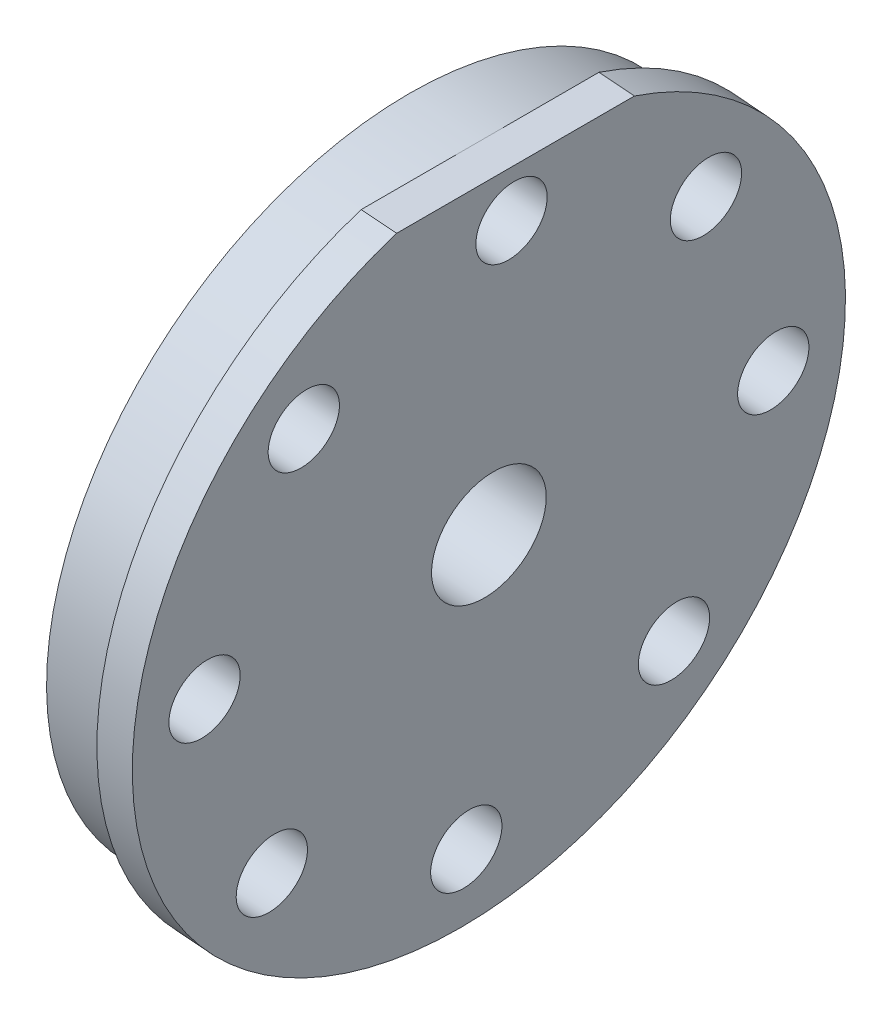
ISO-10303-21;
HEADER;
FILE_DESCRIPTION(('STEP AP214'),'2;1');
FILE_NAME('part.step','',(''),(''),'','','');
FILE_SCHEMA(('AUTOMOTIVE_DESIGN { 1 0 10303 214 1 1 1 1 }'));
ENDSEC;
DATA;
#1=APPLICATION_CONTEXT('core data for automotive mechanical design processes');
#2=APPLICATION_PROTOCOL_DEFINITION('international standard','automotive_design',2000,#1);
#3=PRODUCT_CONTEXT('',#1,'mechanical');
#4=PRODUCT('Part','Part','',(#3));
#5=PRODUCT_RELATED_PRODUCT_CATEGORY('part','',(#4));
#6=PRODUCT_DEFINITION_FORMATION('','',#4);
#7=PRODUCT_DEFINITION_CONTEXT('part definition',#1,'design');
#8=PRODUCT_DEFINITION('design','',#6,#7);
#9=PRODUCT_DEFINITION_SHAPE('','',#8);
#10=(LENGTH_UNIT() NAMED_UNIT(*) SI_UNIT(.MILLI.,.METRE.));
#11=(NAMED_UNIT(*) PLANE_ANGLE_UNIT() SI_UNIT($,.RADIAN.));
#12=(NAMED_UNIT(*) SI_UNIT($,.STERADIAN.) SOLID_ANGLE_UNIT());
#13=UNCERTAINTY_MEASURE_WITH_UNIT(LENGTH_MEASURE(1.E-05),#10,'distance_accuracy_value','');
#14=(GEOMETRIC_REPRESENTATION_CONTEXT(3) GLOBAL_UNCERTAINTY_ASSIGNED_CONTEXT((#13)) GLOBAL_UNIT_ASSIGNED_CONTEXT((#10,
#11,#12)) REPRESENTATION_CONTEXT('',''));
#15=CARTESIAN_POINT('',(0.,0.,0.));
#16=DIRECTION('',(0.,0.,1.));
#17=DIRECTION('',(1.,0.,0.));
#18=AXIS2_PLACEMENT_3D('',#15,#16,#17);
#19=CARTESIAN_POINT('',(230.211383275251,-9.78704603325022,43.174261814343));
#20=DIRECTION('',(0.996833274877087,-0.0795199477981641,0.));
#21=DIRECTION('',(0.0795199477981641,0.996833274877087,0.));
#22=AXIS2_PLACEMENT_3D('',#19,#20,#21);
#23=CYLINDRICAL_SURFACE('',#22,14.9606);
#24=CARTESIAN_POINT('',(233.376328922986,-10.0395218675094,43.174261814343));
#25=DIRECTION('',(-0.996833274877087,0.0795199477981641,0.));
#26=DIRECTION('',(-0.0795199477981641,-0.996833274877087,0.));
#27=AXIS2_PLACEMENT_3D('',#24,#25,#26);
#28=CIRCLE('',#27,14.9606);
#29=CARTESIAN_POINT('',(234.565995054015,4.87370202461675,43.174261814343));
#30=VERTEX_POINT('',#29);
#31=EDGE_CURVE('E71',#30,#30,#28,.F.);
#32=ORIENTED_EDGE('',*,*,#31,.F.);
#33=EDGE_LOOP('',(#32));
#34=FACE_BOUND('',#33,.T.);
#35=CARTESIAN_POINT('',(230.211383275251,-9.78704603325022,43.174261814343));
#36=DIRECTION('',(0.996833274877087,-0.0795199477981641,0.));
#37=DIRECTION('',(0.0795199477981641,0.996833274877087,0.));
#38=AXIS2_PLACEMENT_3D('',#35,#36,#37);
#39=CIRCLE('',#38,14.9606);
#40=CARTESIAN_POINT('',(231.40104940628,5.12617785887592,43.174261814343));
#41=VERTEX_POINT('',#40);
#42=EDGE_CURVE('E131',#41,#41,#39,.T.);
#43=ORIENTED_EDGE('',*,*,#42,.T.);
#44=EDGE_LOOP('',(#43));
#45=FACE_BOUND('',#44,.T.);
#46=ADVANCED_FACE('F36',(#34,#45),#23,.T.);
#47=CARTESIAN_POINT('',(230.211383275251,-9.78704603325022,43.174261814343));
#48=DIRECTION('',(0.996833274877087,-0.0795199477981641,0.));
#49=DIRECTION('',(0.0795199477981641,0.996833274877087,0.));
#50=AXIS2_PLACEMENT_3D('',#47,#48,#49);
#51=PLANE('',#50);
#52=CARTESIAN_POINT('',(230.211383275251,-9.78704603325057,30.4742618143433));
#53=DIRECTION('',(-0.996833274877087,0.0795199477981641,0.));
#54=DIRECTION('',(-0.0795199477981641,-0.996833274877087,0.));
#55=AXIS2_PLACEMENT_3D('',#52,#53,#54);
#56=CIRCLE('',#55,1.5875);
#57=CARTESIAN_POINT('',(230.085145358121,-11.3695188571179,30.4742618143433));
#58=VERTEX_POINT('',#57);
#59=EDGE_CURVE('E91',#58,#58,#56,.T.);
#60=ORIENTED_EDGE('',*,*,#59,.F.);
#61=EDGE_LOOP('',(#60));
#62=FACE_BOUND('',#61,.T.);
#63=CARTESIAN_POINT('',(230.925492773212,-0.835227914850099,34.1940056932739));
#64=DIRECTION('',(-0.996833274877087,0.0795199477981641,0.));
#65=DIRECTION('',(-0.0795199477981641,-0.996833274877087,0.));
#66=AXIS2_PLACEMENT_3D('',#63,#64,#65);
#67=CIRCLE('',#66,1.5875);
#68=CARTESIAN_POINT('',(230.799254856083,-2.41770073871747,34.1940056932739));
#69=VERTEX_POINT('',#68);
#70=EDGE_CURVE('E86',#69,#69,#67,.T.);
#71=ORIENTED_EDGE('',*,*,#70,.F.);
#72=EDGE_LOOP('',(#71));
#73=FACE_BOUND('',#72,.T.);
#74=CARTESIAN_POINT('',(229.497273777289,-18.7388641516508,34.1940056932744));
#75=DIRECTION('',(-0.996833274877087,0.0795199477981641,0.));
#76=DIRECTION('',(-0.0795199477981641,-0.996833274877087,0.));
#77=AXIS2_PLACEMENT_3D('',#74,#75,#76);
#78=CIRCLE('',#77,1.5875);
#79=CARTESIAN_POINT('',(229.37103586016,-20.3213369755182,34.1940056932744));
#80=VERTEX_POINT('',#79);
#81=EDGE_CURVE('E102',#80,#80,#78,.T.);
#82=ORIENTED_EDGE('',*,*,#81,.F.);
#83=EDGE_LOOP('',(#82));
#84=FACE_BOUND('',#83,.T.);
#85=CARTESIAN_POINT('',(229.201479938214,-22.4468286241892,43.1742618143437));
#86=DIRECTION('',(-0.996833274877087,0.0795199477981641,0.));
#87=DIRECTION('',(-0.0795199477981641,-0.996833274877087,0.));
#88=AXIS2_PLACEMENT_3D('',#85,#86,#87);
#89=CIRCLE('',#88,1.5875);
#90=CARTESIAN_POINT('',(229.075242021085,-24.0293014480566,43.1742618143437));
#91=VERTEX_POINT('',#90);
#92=EDGE_CURVE('E97',#91,#91,#89,.T.);
#93=ORIENTED_EDGE('',*,*,#92,.F.);
#94=EDGE_LOOP('',(#93));
#95=FACE_BOUND('',#94,.T.);
#96=CARTESIAN_POINT('',(229.497273777289,-18.7388641516504,52.1545179354127));
#97=DIRECTION('',(-0.996833274877087,0.0795199477981641,0.));
#98=DIRECTION('',(-0.0795199477981641,-0.996833274877087,0.));
#99=AXIS2_PLACEMENT_3D('',#96,#97,#98);
#100=CIRCLE('',#99,1.5875);
#101=CARTESIAN_POINT('',(229.37103586016,-20.3213369755177,52.1545179354127));
#102=VERTEX_POINT('',#101);
#103=EDGE_CURVE('E101',#102,#102,#100,.T.);
#104=ORIENTED_EDGE('',*,*,#103,.F.);
#105=EDGE_LOOP('',(#104));
#106=FACE_BOUND('',#105,.T.);
#107=CARTESIAN_POINT('',(230.211383275251,-9.78704603324989,55.8742618143433));
#108=DIRECTION('',(-0.996833274877087,0.0795199477981641,0.));
#109=DIRECTION('',(-0.0795199477981641,-0.996833274877087,0.));
#110=AXIS2_PLACEMENT_3D('',#107,#108,#109);
#111=CIRCLE('',#110,1.5875);
#112=CARTESIAN_POINT('',(230.085145358121,-11.3695188571173,55.8742618143433));
#113=VERTEX_POINT('',#112);
#114=EDGE_CURVE('E115',#113,#113,#111,.T.);
#115=ORIENTED_EDGE('',*,*,#114,.F.);
#116=EDGE_LOOP('',(#115));
#117=FACE_BOUND('',#116,.T.);
#118=CARTESIAN_POINT('',(230.925492773213,-0.835227914849618,52.1545179354122));
#119=DIRECTION('',(-0.996833274877087,0.0795199477981641,0.));
#120=DIRECTION('',(-0.0795199477981641,-0.996833274877087,0.));
#121=AXIS2_PLACEMENT_3D('',#118,#119,#120);
#122=CIRCLE('',#121,1.5875);
#123=CARTESIAN_POINT('',(230.799254856083,-2.41770073871699,52.1545179354122));
#124=VERTEX_POINT('',#123);
#125=EDGE_CURVE('E112',#124,#124,#122,.T.);
#126=ORIENTED_EDGE('',*,*,#125,.F.);
#127=EDGE_LOOP('',(#126));
#128=FACE_BOUND('',#127,.T.);
#129=CARTESIAN_POINT('',(231.221286612288,2.87273655768877,43.174261814343));
#130=DIRECTION('',(-0.996833274877087,0.0795199477981641,0.));
#131=DIRECTION('',(-0.0795199477981641,-0.996833274877087,0.));
#132=AXIS2_PLACEMENT_3D('',#129,#130,#131);
#133=CIRCLE('',#132,1.5875);
#134=CARTESIAN_POINT('',(231.095048695158,1.2902637338214,43.174261814343));
#135=VERTEX_POINT('',#134);
#136=EDGE_CURVE('E96',#135,#135,#133,.T.);
#137=ORIENTED_EDGE('',*,*,#136,.F.);
#138=EDGE_LOOP('',(#137));
#139=FACE_BOUND('',#138,.T.);
#140=CARTESIAN_POINT('',(230.211383275251,-9.78704603325022,43.174261814343));
#141=DIRECTION('',(0.996833274877087,-0.0795199477981641,0.));
#142=DIRECTION('',(0.0795199477981641,0.996833274877087,0.));
#143=AXIS2_PLACEMENT_3D('',#140,#141,#142);
#144=CIRCLE('',#143,2.5527);
#145=CARTESIAN_POINT('',(230.414373845995,-7.24242973247148,43.174261814343));
#146=VERTEX_POINT('',#145);
#147=EDGE_CURVE('E126',#146,#146,#144,.T.);
#148=ORIENTED_EDGE('',*,*,#147,.T.);
#149=EDGE_LOOP('',(#148));
#150=FACE_BOUND('',#149,.T.);
#151=ORIENTED_EDGE('',*,*,#42,.F.);
#152=EDGE_LOOP('',(#151));
#153=FACE_BOUND('',#152,.T.);
#154=ADVANCED_FACE('F173',(#62,#73,#84,#95,#106,#117,#128,#139,#150,#153),#51,.F.);
#155=CARTESIAN_POINT('',(234.958801746853,-10.165759784639,43.174261814343));
#156=DIRECTION('',(0.996833274877087,-0.0795199477981641,0.));
#157=DIRECTION('',(0.0795199477981641,0.996833274877087,0.));
#158=AXIS2_PLACEMENT_3D('',#155,#156,#157);
#159=PLANE('',#158);
#160=DIRECTION('',(0.,0.,-1.));
#161=VECTOR('',#160,1.);
#162=CARTESIAN_POINT('',(236.148467877882,4.74746410748716,0.));
#163=LINE('',#162,#161);
#164=CARTESIAN_POINT('',(236.148467877882,4.74746410748716,48.4842592380712));
#165=VERTEX_POINT('',#164);
#166=CARTESIAN_POINT('',(236.148467877882,4.74746410748716,37.8642643906148));
#167=VERTEX_POINT('',#166);
#168=EDGE_CURVE('E65',#165,#167,#163,.T.);
#169=ORIENTED_EDGE('',*,*,#168,.F.);
#170=CARTESIAN_POINT('',(234.958801746853,-10.165759784639,43.174261814343));
#171=DIRECTION('',(-0.996833274877087,0.0795199477981641,0.));
#172=DIRECTION('',(-0.0795199477981641,-0.996833274877087,0.));
#173=AXIS2_PLACEMENT_3D('',#170,#171,#172);
#174=CIRCLE('',#173,15.875);
#175=EDGE_CURVE('E76',#167,#165,#174,.T.);
#176=ORIENTED_EDGE('',*,*,#175,.F.);
#177=EDGE_LOOP('',(#169,#176));
#178=FACE_BOUND('',#177,.T.);
#179=CARTESIAN_POINT('',(234.958801746853,-10.1657597846393,30.4742618143433));
#180=DIRECTION('',(0.996833274877087,-0.0795199477981641,0.));
#181=DIRECTION('',(0.0795199477981641,0.996833274877087,0.));
#182=AXIS2_PLACEMENT_3D('',#179,#180,#181);
#183=CIRCLE('',#182,1.5875);
#184=CARTESIAN_POINT('',(235.085039663983,-8.58328696077195,30.4742618143433));
#185=VERTEX_POINT('',#184);
#186=EDGE_CURVE('E127',#185,#185,#183,.T.);
#187=ORIENTED_EDGE('',*,*,#186,.F.);
#188=EDGE_LOOP('',(#187));
#189=FACE_BOUND('',#188,.T.);
#190=CARTESIAN_POINT('',(235.672911244815,-1.21394166623885,34.1940056932739));
#191=DIRECTION('',(0.996833274877087,-0.0795199477981641,0.));
#192=DIRECTION('',(0.0795199477981641,0.996833274877087,0.));
#193=AXIS2_PLACEMENT_3D('',#190,#191,#192);
#194=CIRCLE('',#193,1.5875);
#195=CARTESIAN_POINT('',(235.799149161944,0.36853115762852,34.1940056932739));
#196=VERTEX_POINT('',#195);
#197=EDGE_CURVE('E158',#196,#196,#194,.T.);
#198=ORIENTED_EDGE('',*,*,#197,.F.);
#199=EDGE_LOOP('',(#198));
#200=FACE_BOUND('',#199,.T.);
#201=CARTESIAN_POINT('',(234.244692248891,-19.1175779030396,34.1940056932744));
#202=DIRECTION('',(0.996833274877087,-0.0795199477981641,0.));
#203=DIRECTION('',(0.0795199477981641,0.996833274877087,0.));
#204=AXIS2_PLACEMENT_3D('',#201,#202,#203);
#205=CIRCLE('',#204,1.5875);
#206=CARTESIAN_POINT('',(234.370930166021,-17.5351050791722,34.1940056932744));
#207=VERTEX_POINT('',#206);
#208=EDGE_CURVE('E154',#207,#207,#205,.T.);
#209=ORIENTED_EDGE('',*,*,#208,.F.);
#210=EDGE_LOOP('',(#209));
#211=FACE_BOUND('',#210,.T.);
#212=CARTESIAN_POINT('',(233.948898409816,-22.825542375578,43.1742618143437));
#213=DIRECTION('',(0.996833274877087,-0.0795199477981641,0.));
#214=DIRECTION('',(0.0795199477981641,0.996833274877087,0.));
#215=AXIS2_PLACEMENT_3D('',#212,#213,#214);
#216=CIRCLE('',#215,1.5875);
#217=CARTESIAN_POINT('',(234.075136326946,-21.2430695517106,43.1742618143437));
#218=VERTEX_POINT('',#217);
#219=EDGE_CURVE('E150',#218,#218,#216,.T.);
#220=ORIENTED_EDGE('',*,*,#219,.F.);
#221=EDGE_LOOP('',(#220));
#222=FACE_BOUND('',#221,.T.);
#223=CARTESIAN_POINT('',(234.244692248891,-19.1175779030391,52.1545179354127));
#224=DIRECTION('',(0.996833274877087,-0.0795199477981641,0.));
#225=DIRECTION('',(0.0795199477981641,0.996833274877087,0.));
#226=AXIS2_PLACEMENT_3D('',#223,#224,#225);
#227=CIRCLE('',#226,1.5875);
#228=CARTESIAN_POINT('',(234.370930166021,-17.5351050791717,52.1545179354127));
#229=VERTEX_POINT('',#228);
#230=EDGE_CURVE('E146',#229,#229,#227,.T.);
#231=ORIENTED_EDGE('',*,*,#230,.F.);
#232=EDGE_LOOP('',(#231));
#233=FACE_BOUND('',#232,.T.);
#234=CARTESIAN_POINT('',(234.958801746853,-10.1657597846386,55.8742618143433));
#235=DIRECTION('',(0.996833274877087,-0.0795199477981641,0.));
#236=DIRECTION('',(0.0795199477981641,0.996833274877087,0.));
#237=AXIS2_PLACEMENT_3D('',#234,#235,#236);
#238=CIRCLE('',#237,1.5875);
#239=CARTESIAN_POINT('',(235.085039663983,-8.58328696077126,55.8742618143433));
#240=VERTEX_POINT('',#239);
#241=EDGE_CURVE('E142',#240,#240,#238,.T.);
#242=ORIENTED_EDGE('',*,*,#241,.F.);
#243=EDGE_LOOP('',(#242));
#244=FACE_BOUND('',#243,.T.);
#245=CARTESIAN_POINT('',(235.672911244815,-1.21394166623837,52.1545179354122));
#246=DIRECTION('',(0.996833274877087,-0.0795199477981641,0.));
#247=DIRECTION('',(0.0795199477981641,0.996833274877087,0.));
#248=AXIS2_PLACEMENT_3D('',#245,#246,#247);
#249=CIRCLE('',#248,1.5875);
#250=CARTESIAN_POINT('',(235.799149161944,0.368531157629006,52.1545179354122));
#251=VERTEX_POINT('',#250);
#252=EDGE_CURVE('E138',#251,#251,#249,.T.);
#253=ORIENTED_EDGE('',*,*,#252,.F.);
#254=EDGE_LOOP('',(#253));
#255=FACE_BOUND('',#254,.T.);
#256=CARTESIAN_POINT('',(235.96870508389,2.49402280630002,43.174261814343));
#257=DIRECTION('',(0.996833274877087,-0.0795199477981641,0.));
#258=DIRECTION('',(0.0795199477981641,0.996833274877087,0.));
#259=AXIS2_PLACEMENT_3D('',#256,#257,#258);
#260=CIRCLE('',#259,1.5875);
#261=CARTESIAN_POINT('',(236.094943001019,4.0764956301674,43.174261814343));
#262=VERTEX_POINT('',#261);
#263=EDGE_CURVE('E95',#262,#262,#260,.T.);
#264=ORIENTED_EDGE('',*,*,#263,.F.);
#265=EDGE_LOOP('',(#264));
#266=FACE_BOUND('',#265,.T.);
#267=CARTESIAN_POINT('',(234.958801746853,-10.165759784639,43.174261814343));
#268=DIRECTION('',(0.996833274877087,-0.0795199477981641,0.));
#269=DIRECTION('',(0.0795199477981641,0.996833274877087,0.));
#270=AXIS2_PLACEMENT_3D('',#267,#268,#269);
#271=CIRCLE('',#270,2.5527);
#272=CARTESIAN_POINT('',(235.161792317597,-7.62114348386024,43.174261814343));
#273=VERTEX_POINT('',#272);
#274=EDGE_CURVE('E122',#273,#273,#271,.T.);
#275=ORIENTED_EDGE('',*,*,#274,.F.);
#276=EDGE_LOOP('',(#275));
#277=FACE_BOUND('',#276,.T.);
#278=ADVANCED_FACE('F74',(#178,#189,#200,#211,#222,#233,#244,#255,#266,#277),#159,.T.);
#279=CARTESIAN_POINT('',(228.628910451384,-9.66080811612064,43.174261814343));
#280=DIRECTION('',(0.996833274877087,-0.0795199477981641,0.));
#281=DIRECTION('',(0.0795199477981641,0.996833274877087,0.));
#282=AXIS2_PLACEMENT_3D('',#279,#280,#281);
#283=CYLINDRICAL_SURFACE('',#282,2.5527);
#284=ORIENTED_EDGE('',*,*,#274,.T.);
#285=EDGE_LOOP('',(#284));
#286=FACE_BOUND('',#285,.T.);
#287=ORIENTED_EDGE('',*,*,#147,.F.);
#288=EDGE_LOOP('',(#287));
#289=FACE_BOUND('',#288,.T.);
#290=ADVANCED_FACE('F182',(#286,#289),#283,.F.);
#291=CARTESIAN_POINT('',(241.189619361059,2.07753707970713,43.174261814343));
#292=DIRECTION('',(-0.996833274877087,0.0795199477981641,0.));
#293=DIRECTION('',(-0.0795199477981641,-0.996833274877087,0.));
#294=AXIS2_PLACEMENT_3D('',#291,#292,#293);
#295=CYLINDRICAL_SURFACE('',#294,1.5875);
#296=ORIENTED_EDGE('',*,*,#263,.T.);
#297=EDGE_LOOP('',(#296));
#298=FACE_BOUND('',#297,.T.);
#299=ORIENTED_EDGE('',*,*,#136,.T.);
#300=EDGE_LOOP('',(#299));
#301=FACE_BOUND('',#300,.T.);
#302=ADVANCED_FACE('F188',(#298,#301),#295,.F.);
#303=CARTESIAN_POINT('',(240.893825521983,-1.63042739283126,52.1545179354122));
#304=DIRECTION('',(-0.996833274877087,0.0795199477981641,0.));
#305=DIRECTION('',(-0.0795199477981641,-0.996833274877087,0.));
#306=AXIS2_PLACEMENT_3D('',#303,#304,#305);
#307=CYLINDRICAL_SURFACE('',#306,1.5875);
#308=ORIENTED_EDGE('',*,*,#252,.T.);
#309=EDGE_LOOP('',(#308));
#310=FACE_BOUND('',#309,.T.);
#311=ORIENTED_EDGE('',*,*,#125,.T.);
#312=EDGE_LOOP('',(#311));
#313=FACE_BOUND('',#312,.T.);
#314=ADVANCED_FACE('F198',(#310,#313),#307,.F.);
#315=CARTESIAN_POINT('',(240.179716024022,-10.5822455112315,55.8742618143433));
#316=DIRECTION('',(-0.996833274877087,0.0795199477981641,0.));
#317=DIRECTION('',(-0.0795199477981641,-0.996833274877087,0.));
#318=AXIS2_PLACEMENT_3D('',#315,#316,#317);
#319=CYLINDRICAL_SURFACE('',#318,1.5875);
#320=ORIENTED_EDGE('',*,*,#241,.T.);
#321=EDGE_LOOP('',(#320));
#322=FACE_BOUND('',#321,.T.);
#323=ORIENTED_EDGE('',*,*,#114,.T.);
#324=EDGE_LOOP('',(#323));
#325=FACE_BOUND('',#324,.T.);
#326=ADVANCED_FACE('F194',(#322,#325),#319,.F.);
#327=CARTESIAN_POINT('',(239.46560652606,-19.534063629632,52.1545179354127));
#328=DIRECTION('',(-0.996833274877087,0.0795199477981641,0.));
#329=DIRECTION('',(-0.0795199477981641,-0.996833274877087,0.));
#330=AXIS2_PLACEMENT_3D('',#327,#328,#329);
#331=CYLINDRICAL_SURFACE('',#330,1.5875);
#332=ORIENTED_EDGE('',*,*,#230,.T.);
#333=EDGE_LOOP('',(#332));
#334=FACE_BOUND('',#333,.T.);
#335=ORIENTED_EDGE('',*,*,#103,.T.);
#336=EDGE_LOOP('',(#335));
#337=FACE_BOUND('',#336,.T.);
#338=ADVANCED_FACE('F190',(#334,#337),#331,.F.);
#339=CARTESIAN_POINT('',(239.169812686985,-23.2420281021709,43.1742618143437));
#340=DIRECTION('',(-0.996833274877087,0.0795199477981641,0.));
#341=DIRECTION('',(-0.0795199477981641,-0.996833274877087,0.));
#342=AXIS2_PLACEMENT_3D('',#339,#340,#341);
#343=CYLINDRICAL_SURFACE('',#342,1.5875);
#344=ORIENTED_EDGE('',*,*,#219,.T.);
#345=EDGE_LOOP('',(#344));
#346=FACE_BOUND('',#345,.T.);
#347=ORIENTED_EDGE('',*,*,#92,.T.);
#348=EDGE_LOOP('',(#347));
#349=FACE_BOUND('',#348,.T.);
#350=ADVANCED_FACE('F193',(#346,#349),#343,.F.);
#351=CARTESIAN_POINT('',(239.46560652606,-19.5340636296325,34.1940056932744));
#352=DIRECTION('',(-0.996833274877087,0.0795199477981641,0.));
#353=DIRECTION('',(-0.0795199477981641,-0.996833274877087,0.));
#354=AXIS2_PLACEMENT_3D('',#351,#352,#353);
#355=CYLINDRICAL_SURFACE('',#354,1.5875);
#356=ORIENTED_EDGE('',*,*,#208,.T.);
#357=EDGE_LOOP('',(#356));
#358=FACE_BOUND('',#357,.T.);
#359=ORIENTED_EDGE('',*,*,#81,.T.);
#360=EDGE_LOOP('',(#359));
#361=FACE_BOUND('',#360,.T.);
#362=ADVANCED_FACE('F210',(#358,#361),#355,.F.);
#363=CARTESIAN_POINT('',(240.893825521983,-1.63042739283174,34.1940056932739));
#364=DIRECTION('',(-0.996833274877087,0.0795199477981641,0.));
#365=DIRECTION('',(-0.0795199477981641,-0.996833274877087,0.));
#366=AXIS2_PLACEMENT_3D('',#363,#364,#365);
#367=CYLINDRICAL_SURFACE('',#366,1.5875);
#368=ORIENTED_EDGE('',*,*,#197,.T.);
#369=EDGE_LOOP('',(#368));
#370=FACE_BOUND('',#369,.T.);
#371=ORIENTED_EDGE('',*,*,#70,.T.);
#372=EDGE_LOOP('',(#371));
#373=FACE_BOUND('',#372,.T.);
#374=ADVANCED_FACE('F206',(#370,#373),#367,.F.);
#375=CARTESIAN_POINT('',(240.179716024022,-10.5822455112322,30.4742618143433));
#376=DIRECTION('',(-0.996833274877087,0.0795199477981641,0.));
#377=DIRECTION('',(-0.0795199477981641,-0.996833274877087,0.));
#378=AXIS2_PLACEMENT_3D('',#375,#376,#377);
#379=CYLINDRICAL_SURFACE('',#378,1.5875);
#380=ORIENTED_EDGE('',*,*,#186,.T.);
#381=EDGE_LOOP('',(#380));
#382=FACE_BOUND('',#381,.T.);
#383=ORIENTED_EDGE('',*,*,#59,.T.);
#384=EDGE_LOOP('',(#383));
#385=FACE_BOUND('',#384,.T.);
#386=ADVANCED_FACE('F209',(#382,#385),#379,.F.);
#387=CARTESIAN_POINT('',(233.376328922986,-10.0395218675094,43.174261814343));
#388=DIRECTION('',(-0.996833274877087,0.0795199477981641,0.));
#389=DIRECTION('',(-0.0795199477981641,-0.996833274877087,0.));
#390=AXIS2_PLACEMENT_3D('',#387,#388,#389);
#391=PLANE('',#390);
#392=DIRECTION('',(0.,0.,1.));
#393=VECTOR('',#392,1.);
#394=CARTESIAN_POINT('',(234.565995054015,4.87370202461675,43.174261814343));
#395=LINE('',#394,#393);
#396=CARTESIAN_POINT('',(234.565995054015,4.87370202461675,37.8642643906148));
#397=VERTEX_POINT('',#396);
#398=EDGE_CURVE('E56',#397,#30,#395,.T.);
#399=ORIENTED_EDGE('',*,*,#398,.F.);
#400=CARTESIAN_POINT('',(233.376328922986,-10.0395218675094,43.174261814343));
#401=DIRECTION('',(-0.996833274877087,0.0795199477981641,0.));
#402=DIRECTION('',(-0.0795199477981641,-0.996833274877087,0.));
#403=AXIS2_PLACEMENT_3D('',#400,#401,#402);
#404=CIRCLE('',#403,15.875);
#405=CARTESIAN_POINT('',(234.565995054015,4.87370202461674,48.4842592380712));
#406=VERTEX_POINT('',#405);
#407=EDGE_CURVE('E81',#397,#406,#404,.T.);
#408=ORIENTED_EDGE('',*,*,#407,.T.);
#409=EDGE_CURVE('E51',#30,#406,#395,.T.);
#410=ORIENTED_EDGE('',*,*,#409,.F.);
#411=ORIENTED_EDGE('',*,*,#31,.T.);
#412=EDGE_LOOP('',(#399,#408,#410,#411));
#413=FACE_BOUND('',#412,.T.);
#414=ADVANCED_FACE('F169',(#413),#391,.T.);
#415=CARTESIAN_POINT('',(233.376328922986,-10.0395218675094,43.174261814343));
#416=DIRECTION('',(0.996833274877087,-0.0795199477981641,0.));
#417=DIRECTION('',(0.0795199477981641,0.996833274877087,0.));
#418=AXIS2_PLACEMENT_3D('',#415,#416,#417);
#419=CYLINDRICAL_SURFACE('',#418,15.875);
#420=ORIENTED_EDGE('',*,*,#407,.F.);
#421=DIRECTION('',(0.996833274877087,-0.0795199477981641,0.));
#422=VECTOR('',#421,1.);
#423=CARTESIAN_POINT('',(234.565995054015,4.87370202461674,37.8642643906148));
#424=LINE('',#423,#422);
#425=EDGE_CURVE('E11',#397,#167,#424,.T.);
#426=ORIENTED_EDGE('',*,*,#425,.T.);
#427=ORIENTED_EDGE('',*,*,#175,.T.);
#428=DIRECTION('',(0.996833274877087,-0.0795199477981641,0.));
#429=VECTOR('',#428,1.);
#430=CARTESIAN_POINT('',(234.565995054015,4.87370202461674,48.4842592380712));
#431=LINE('',#430,#429);
#432=EDGE_CURVE('E44',#165,#406,#431,.F.);
#433=ORIENTED_EDGE('',*,*,#432,.T.);
#434=EDGE_LOOP('',(#420,#426,#427,#433));
#435=FACE_BOUND('',#434,.T.);
#436=ADVANCED_FACE('F79',(#435),#419,.T.);
#437=CARTESIAN_POINT('',(233.616511359695,4.94944477489449,0.));
#438=DIRECTION('',(-0.0795199477981641,-0.996833274877087,0.));
#439=DIRECTION('',(0.996833274877087,-0.0795199477981641,0.));
#440=AXIS2_PLACEMENT_3D('',#437,#438,#439);
#441=PLANE('',#440);
#442=ORIENTED_EDGE('',*,*,#398,.T.);
#443=ORIENTED_EDGE('',*,*,#409,.T.);
#444=ORIENTED_EDGE('',*,*,#432,.F.);
#445=ORIENTED_EDGE('',*,*,#168,.T.);
#446=ORIENTED_EDGE('',*,*,#425,.F.);
#447=EDGE_LOOP('',(#442,#443,#444,#445,#446));
#448=FACE_BOUND('',#447,.T.);
#449=ADVANCED_FACE('F64',(#448),#441,.F.);
#450=CLOSED_SHELL('',(#46,#154,#278,#290,#302,#314,#326,#338,#350,#362,#374,#386,#414,#436,#449));
#451=MANIFOLD_SOLID_BREP('B2',#450);
#452=ADVANCED_BREP_SHAPE_REPRESENTATION('',(#18,#451),#14);
#453=SHAPE_DEFINITION_REPRESENTATION(#9,#452);
ENDSEC;
END-ISO-10303-21;
